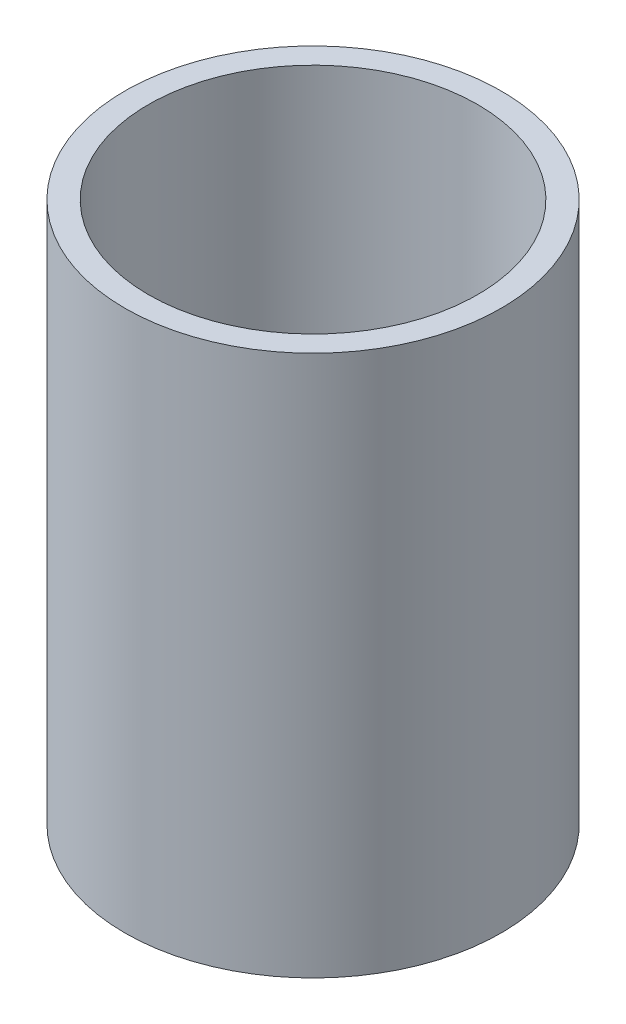
ISO-10303-21;
HEADER;
FILE_DESCRIPTION(('STEP AP214'),'2;1');
FILE_NAME('part.step','',(''),(''),'','','');
FILE_SCHEMA(('AUTOMOTIVE_DESIGN { 1 0 10303 214 1 1 1 1 }'));
ENDSEC;
DATA;
#1=APPLICATION_CONTEXT('core data for automotive mechanical design processes');
#2=APPLICATION_PROTOCOL_DEFINITION('international standard','automotive_design',2000,#1);
#3=PRODUCT_CONTEXT('',#1,'mechanical');
#4=PRODUCT('Part','Part','',(#3));
#5=PRODUCT_RELATED_PRODUCT_CATEGORY('part','',(#4));
#6=PRODUCT_DEFINITION_FORMATION('','',#4);
#7=PRODUCT_DEFINITION_CONTEXT('part definition',#1,'design');
#8=PRODUCT_DEFINITION('design','',#6,#7);
#9=PRODUCT_DEFINITION_SHAPE('','',#8);
#10=(LENGTH_UNIT() NAMED_UNIT(*) SI_UNIT(.MILLI.,.METRE.));
#11=(NAMED_UNIT(*) PLANE_ANGLE_UNIT() SI_UNIT($,.RADIAN.));
#12=(NAMED_UNIT(*) SI_UNIT($,.STERADIAN.) SOLID_ANGLE_UNIT());
#13=UNCERTAINTY_MEASURE_WITH_UNIT(LENGTH_MEASURE(1.E-05),#10,'distance_accuracy_value','');
#14=(GEOMETRIC_REPRESENTATION_CONTEXT(3) GLOBAL_UNCERTAINTY_ASSIGNED_CONTEXT((#13)) GLOBAL_UNIT_ASSIGNED_CONTEXT((#10,
#11,#12)) REPRESENTATION_CONTEXT('',''));
#15=CARTESIAN_POINT('',(0.,0.,0.));
#16=DIRECTION('',(0.,0.,1.));
#17=DIRECTION('',(1.,0.,0.));
#18=AXIS2_PLACEMENT_3D('',#15,#16,#17);
#19=CARTESIAN_POINT('',(0.,0.,0.));
#20=DIRECTION('',(0.,-1.,0.));
#21=DIRECTION('',(0.,0.,-1.));
#22=AXIS2_PLACEMENT_3D('',#19,#20,#21);
#23=CYLINDRICAL_SURFACE('',#22,6.);
#24=CARTESIAN_POINT('',(0.,10.,0.));
#25=DIRECTION('',(0.,-1.,0.));
#26=DIRECTION('',(0.,0.,-1.));
#27=AXIS2_PLACEMENT_3D('',#24,#25,#26);
#28=CIRCLE('',#27,6.);
#29=CARTESIAN_POINT('',(0.,10.,-6.));
#30=VERTEX_POINT('',#29);
#31=EDGE_CURVE('P0_E21',#30,#30,#28,.T.);
#32=ORIENTED_EDGE('',*,*,#31,.T.);
#33=EDGE_LOOP('',(#32));
#34=FACE_BOUND('',#33,.T.);
#35=CARTESIAN_POINT('',(0.,0.,0.));
#36=DIRECTION('',(0.,-1.,0.));
#37=DIRECTION('',(0.,0.,-1.));
#38=AXIS2_PLACEMENT_3D('',#35,#36,#37);
#39=CIRCLE('',#38,6.);
#40=CARTESIAN_POINT('',(0.,0.,-6.));
#41=VERTEX_POINT('',#40);
#42=EDGE_CURVE('P0_E11',#41,#41,#39,.F.);
#43=ORIENTED_EDGE('',*,*,#42,.T.);
#44=EDGE_LOOP('',(#43));
#45=FACE_BOUND('',#44,.T.);
#46=ADVANCED_FACE('P0_F17',(#34,#45),#23,.T.);
#47=CARTESIAN_POINT('',(0.,10.,0.));
#48=DIRECTION('',(0.,-1.,0.));
#49=DIRECTION('',(0.,0.,-1.));
#50=AXIS2_PLACEMENT_3D('',#47,#48,#49);
#51=PLANE('',#50);
#52=CARTESIAN_POINT('',(-5.5,10.,0.));
#53=CARTESIAN_POINT('',(-5.49979763081145,10.,1.04933333208296));
#54=CARTESIAN_POINT('',(-5.11383565584337,10.,2.0245209025903));
#55=CARTESIAN_POINT('',(-4.90883318380038,10.,2.54248867046726));
#56=CARTESIAN_POINT('',(-4.60347531170258,10.,3.00965364361828));
#57=CARTESIAN_POINT('',(-4.29215472203222,10.,3.48594093863891));
#58=CARTESIAN_POINT('',(-3.88908729652601,10.,3.88908729652601));
#59=CARTESIAN_POINT('',(-3.48677723621765,10.,4.29147614090102));
#60=CARTESIAN_POINT('',(-3.00965364361828,10.,4.60347531170258));
#61=CARTESIAN_POINT('',(-2.54342572799408,10.,4.90834961541666));
#62=CARTESIAN_POINT('',(-2.0245209025903,10.,5.11383565584337));
#63=CARTESIAN_POINT('',(-1.5274821776722,10.,5.31066273187351));
#64=CARTESIAN_POINT('',(-1.0007967882668,10.,5.40817952629116));
#65=CARTESIAN_POINT('',(-0.505140140522324,10.,5.49995129059699));
#66=CARTESIAN_POINT('',(0.,10.,5.5));
#67=CARTESIAN_POINT('',(0.504080942889697,10.,5.50004860726723));
#68=CARTESIAN_POINT('',(1.0007967882668,10.,5.40817952629116));
#69=CARTESIAN_POINT('',(1.52647327950265,10.,5.31095408725992));
#70=CARTESIAN_POINT('',(2.0245209025903,10.,5.11383565584337));
#71=CARTESIAN_POINT('',(2.54248867047157,10.,4.9088331837984));
#72=CARTESIAN_POINT('',(3.00965364361828,10.,4.60347531170258));
#73=CARTESIAN_POINT('',(3.48594093864537,10.,4.29215472202714));
#74=CARTESIAN_POINT('',(3.88908729652601,10.,3.88908729652601));
#75=CARTESIAN_POINT('',(4.29147614090424,10.,3.48677723621306));
#76=CARTESIAN_POINT('',(4.60347531170258,10.,3.00965364361828));
#77=CARTESIAN_POINT('',(4.90834961541548,10.,2.54342572799557));
#78=CARTESIAN_POINT('',(5.11383565584337,10.,2.0245209025903));
#79=CARTESIAN_POINT('',(5.31066273187336,10.,1.52748217767401));
#80=CARTESIAN_POINT('',(5.40817952629116,10.,1.0007967882668));
#81=CARTESIAN_POINT('',(5.49990253040514,10.,0.505403492908883));
#82=CARTESIAN_POINT('',(5.5,10.,0.));
#83=B_SPLINE_CURVE_WITH_KNOTS('',2,(#52,#53,#54,#55,#56,#57,#58,#59,#60,#61,#62,#63,#64,#65,#66,
#67,#68,#69,#70,#71,#72,#73,#74,#75,#76,#77,#78,#79,#80,#81,#82),.UNSPECIFIED.,.F.,.F.,(3,2,2,2,
2,2,2,2,2,2,2,2,2,2,2,3),(0.,0.125,0.1875,0.25,0.3125,0.375,0.4375,0.5,0.5625,0.625,0.6875,0.75,
0.8125,0.875,0.9375,1.),.UNSPECIFIED.);
#84=CARTESIAN_POINT('',(-5.5,10.,0.));
#85=VERTEX_POINT('',#84);
#86=CARTESIAN_POINT('',(5.5,10.,0.));
#87=VERTEX_POINT('',#86);
#88=EDGE_CURVE('P0_E29',#85,#87,#83,.T.);
#89=ORIENTED_EDGE('',*,*,#88,.F.);
#90=CARTESIAN_POINT('',(5.5,10.,0.));
#91=CARTESIAN_POINT('',(5.49979763081145,10.,-1.04933333208296));
#92=CARTESIAN_POINT('',(5.11383565584337,10.,-2.0245209025903));
#93=CARTESIAN_POINT('',(4.90883318380038,10.,-2.54248867046726));
#94=CARTESIAN_POINT('',(4.60347531170258,10.,-3.00965364361828));
#95=CARTESIAN_POINT('',(4.29215472203222,10.,-3.48594093863891));
#96=CARTESIAN_POINT('',(3.88908729652601,10.,-3.88908729652601));
#97=CARTESIAN_POINT('',(3.48677723621765,10.,-4.29147614090102));
#98=CARTESIAN_POINT('',(3.00965364361828,10.,-4.60347531170258));
#99=CARTESIAN_POINT('',(2.54342572799408,10.,-4.90834961541666));
#100=CARTESIAN_POINT('',(2.0245209025903,10.,-5.11383565584337));
#101=CARTESIAN_POINT('',(1.5274821776722,10.,-5.31066273187351));
#102=CARTESIAN_POINT('',(1.0007967882668,10.,-5.40817952629116));
#103=CARTESIAN_POINT('',(0.505140140522324,10.,-5.49995129059699));
#104=CARTESIAN_POINT('',(0.,10.,-5.5));
#105=CARTESIAN_POINT('',(-0.504080942889697,10.,-5.50004860726723));
#106=CARTESIAN_POINT('',(-1.0007967882668,10.,-5.40817952629116));
#107=CARTESIAN_POINT('',(-1.52647327950265,10.,-5.31095408725992));
#108=CARTESIAN_POINT('',(-2.0245209025903,10.,-5.11383565584337));
#109=CARTESIAN_POINT('',(-2.54248867047157,10.,-4.9088331837984));
#110=CARTESIAN_POINT('',(-3.00965364361828,10.,-4.60347531170258));
#111=CARTESIAN_POINT('',(-3.48594093864537,10.,-4.29215472202714));
#112=CARTESIAN_POINT('',(-3.88908729652601,10.,-3.88908729652601));
#113=CARTESIAN_POINT('',(-4.29147614090424,10.,-3.48677723621306));
#114=CARTESIAN_POINT('',(-4.60347531170258,10.,-3.00965364361828));
#115=CARTESIAN_POINT('',(-4.90834961541548,10.,-2.54342572799557));
#116=CARTESIAN_POINT('',(-5.11383565584337,10.,-2.0245209025903));
#117=CARTESIAN_POINT('',(-5.31066273187336,10.,-1.52748217767401));
#118=CARTESIAN_POINT('',(-5.40817952629116,10.,-1.0007967882668));
#119=CARTESIAN_POINT('',(-5.49990253040514,10.,-0.505403492908883));
#120=CARTESIAN_POINT('',(-5.5,10.,0.));
#121=B_SPLINE_CURVE_WITH_KNOTS('',2,(#90,#91,#92,#93,#94,#95,#96,#97,#98,#99,#100,#101,#102,
#103,#104,#105,#106,#107,#108,#109,#110,#111,#112,#113,#114,#115,#116,#117,#118,#119,#120),
.UNSPECIFIED.,.F.,.F.,(3,2,2,2,2,2,2,2,2,2,2,2,2,2,2,3),(0.,0.125,0.1875,0.25,0.3125,0.375,
0.4375,0.5,0.5625,0.625,0.6875,0.75,0.8125,0.875,0.9375,1.),.UNSPECIFIED.);
#122=EDGE_CURVE('P0_E34',#87,#85,#121,.T.);
#123=ORIENTED_EDGE('',*,*,#122,.F.);
#124=EDGE_LOOP('',(#89,#123));
#125=FACE_BOUND('',#124,.T.);
#126=ORIENTED_EDGE('',*,*,#31,.F.);
#127=EDGE_LOOP('',(#126));
#128=FACE_BOUND('',#127,.T.);
#129=ADVANCED_FACE('P0_F18',(#125,#128),#51,.F.);
#130=OPEN_SHELL('',(#46,#129));
#131=SHELL_BASED_SURFACE_MODEL('P0_B1',(#130));
#132=CARTESIAN_POINT('',(0.,10.,0.));
#133=DIRECTION('',(0.,1.,0.));
#134=DIRECTION('',(0.,0.,1.));
#135=AXIS2_PLACEMENT_3D('',#132,#133,#134);
#136=PLANE('',#135);
#137=CARTESIAN_POINT('',(0.,10.,0.));
#138=DIRECTION('',(0.,1.,0.));
#139=DIRECTION('',(0.,0.,1.));
#140=AXIS2_PLACEMENT_3D('',#137,#138,#139);
#141=CIRCLE('',#140,5.5);
#142=CARTESIAN_POINT('',(0.,10.,5.5));
#143=VERTEX_POINT('',#142);
#144=EDGE_CURVE('P1_E34',#143,#143,#141,.F.);
#145=ORIENTED_EDGE('',*,*,#144,.T.);
#146=EDGE_LOOP('',(#145));
#147=FACE_BOUND('',#146,.T.);
#148=CARTESIAN_POINT('',(0.,10.,0.));
#149=DIRECTION('',(0.,1.,0.));
#150=DIRECTION('',(0.,0.,1.));
#151=AXIS2_PLACEMENT_3D('',#148,#149,#150);
#152=CIRCLE('',#151,7.);
#153=CARTESIAN_POINT('',(0.,10.,7.));
#154=VERTEX_POINT('',#153);
#155=EDGE_CURVE('P1_E18',#154,#154,#152,.T.);
#156=ORIENTED_EDGE('',*,*,#155,.T.);
#157=EDGE_LOOP('',(#156));
#158=FACE_BOUND('',#157,.T.);
#159=ADVANCED_FACE('P1_F15',(#147,#158),#136,.T.);
#160=CARTESIAN_POINT('',(0.,23.,0.));
#161=DIRECTION('',(0.,1.,0.));
#162=DIRECTION('',(0.,0.,1.));
#163=AXIS2_PLACEMENT_3D('',#160,#161,#162);
#164=CYLINDRICAL_SURFACE('',#163,7.);
#165=ORIENTED_EDGE('',*,*,#155,.F.);
#166=EDGE_LOOP('',(#165));
#167=FACE_BOUND('',#166,.T.);
#168=CARTESIAN_POINT('',(0.,23.,0.));
#169=DIRECTION('',(0.,1.,0.));
#170=DIRECTION('',(0.,0.,1.));
#171=AXIS2_PLACEMENT_3D('',#168,#169,#170);
#172=CIRCLE('',#171,7.);
#173=CARTESIAN_POINT('',(0.,23.,7.));
#174=VERTEX_POINT('',#173);
#175=EDGE_CURVE('P1_E32',#174,#174,#172,.F.);
#176=ORIENTED_EDGE('',*,*,#175,.F.);
#177=EDGE_LOOP('',(#176));
#178=FACE_BOUND('',#177,.T.);
#179=ADVANCED_FACE('P1_F42',(#167,#178),#164,.F.);
#180=CARTESIAN_POINT('',(0.,0.,0.));
#181=DIRECTION('',(0.,1.,0.));
#182=DIRECTION('',(0.,0.,1.));
#183=AXIS2_PLACEMENT_3D('',#180,#181,#182);
#184=CYLINDRICAL_SURFACE('',#183,5.5);
#185=CARTESIAN_POINT('',(0.,0.,0.));
#186=DIRECTION('',(0.,1.,0.));
#187=DIRECTION('',(0.,0.,1.));
#188=AXIS2_PLACEMENT_3D('',#185,#186,#187);
#189=CIRCLE('',#188,5.5);
#190=CARTESIAN_POINT('',(0.,0.,5.5));
#191=VERTEX_POINT('',#190);
#192=EDGE_CURVE('P1_E27',#191,#191,#189,.F.);
#193=ORIENTED_EDGE('',*,*,#192,.T.);
#194=EDGE_LOOP('',(#193));
#195=FACE_BOUND('',#194,.T.);
#196=ORIENTED_EDGE('',*,*,#144,.F.);
#197=EDGE_LOOP('',(#196));
#198=FACE_BOUND('',#197,.T.);
#199=ADVANCED_FACE('P1_F45',(#195,#198),#184,.F.);
#200=CARTESIAN_POINT('',(0.,23.,0.));
#201=DIRECTION('',(0.,1.,0.));
#202=DIRECTION('',(0.,0.,1.));
#203=AXIS2_PLACEMENT_3D('',#200,#201,#202);
#204=PLANE('',#203);
#205=ORIENTED_EDGE('',*,*,#175,.T.);
#206=EDGE_LOOP('',(#205));
#207=FACE_BOUND('',#206,.T.);
#208=CARTESIAN_POINT('',(0.,23.,0.));
#209=DIRECTION('',(0.,1.,0.));
#210=DIRECTION('',(0.,0.,1.));
#211=AXIS2_PLACEMENT_3D('',#208,#209,#210);
#212=CIRCLE('',#211,8.);
#213=CARTESIAN_POINT('',(0.,23.,8.));
#214=VERTEX_POINT('',#213);
#215=EDGE_CURVE('P1_E22',#214,#214,#212,.F.);
#216=ORIENTED_EDGE('',*,*,#215,.F.);
#217=EDGE_LOOP('',(#216));
#218=FACE_BOUND('',#217,.T.);
#219=ADVANCED_FACE('P1_F48',(#207,#218),#204,.T.);
#220=CARTESIAN_POINT('',(0.,0.,0.));
#221=DIRECTION('',(0.,1.,0.));
#222=DIRECTION('',(0.,0.,1.));
#223=AXIS2_PLACEMENT_3D('',#220,#221,#222);
#224=PLANE('',#223);
#225=ORIENTED_EDGE('',*,*,#192,.F.);
#226=EDGE_LOOP('',(#225));
#227=FACE_BOUND('',#226,.T.);
#228=CARTESIAN_POINT('',(0.,0.,0.));
#229=DIRECTION('',(0.,1.,0.));
#230=DIRECTION('',(0.,0.,1.));
#231=AXIS2_PLACEMENT_3D('',#228,#229,#230);
#232=CIRCLE('',#231,8.);
#233=CARTESIAN_POINT('',(0.,0.,8.));
#234=VERTEX_POINT('',#233);
#235=EDGE_CURVE('P1_E10',#234,#234,#232,.T.);
#236=ORIENTED_EDGE('',*,*,#235,.F.);
#237=EDGE_LOOP('',(#236));
#238=FACE_BOUND('',#237,.T.);
#239=ADVANCED_FACE('P1_F51',(#227,#238),#224,.F.);
#240=CARTESIAN_POINT('',(0.,0.,0.));
#241=DIRECTION('',(0.,1.,0.));
#242=DIRECTION('',(0.,0.,1.));
#243=AXIS2_PLACEMENT_3D('',#240,#241,#242);
#244=CYLINDRICAL_SURFACE('',#243,8.);
#245=ORIENTED_EDGE('',*,*,#215,.T.);
#246=EDGE_LOOP('',(#245));
#247=FACE_BOUND('',#246,.T.);
#248=ORIENTED_EDGE('',*,*,#235,.T.);
#249=EDGE_LOOP('',(#248));
#250=FACE_BOUND('',#249,.T.);
#251=ADVANCED_FACE('P1_F55',(#247,#250),#244,.T.);
#252=CLOSED_SHELL('',(#159,#179,#199,#219,#239,#251));
#253=MANIFOLD_SOLID_BREP('P1_B1',#252);
#254=ADVANCED_BREP_SHAPE_REPRESENTATION('',(#18,#253),#14);
#255=MANIFOLD_SURFACE_SHAPE_REPRESENTATION('',(#18,#131),#14);
#256=SHAPE_REPRESENTATION('',(#18),#14);
#257=SHAPE_DEFINITION_REPRESENTATION(#9,#256);
#258=SHAPE_REPRESENTATION_RELATIONSHIP('','',#256,#254);
#259=SHAPE_REPRESENTATION_RELATIONSHIP('','',#256,#255);
ENDSEC;
END-ISO-10303-21;
